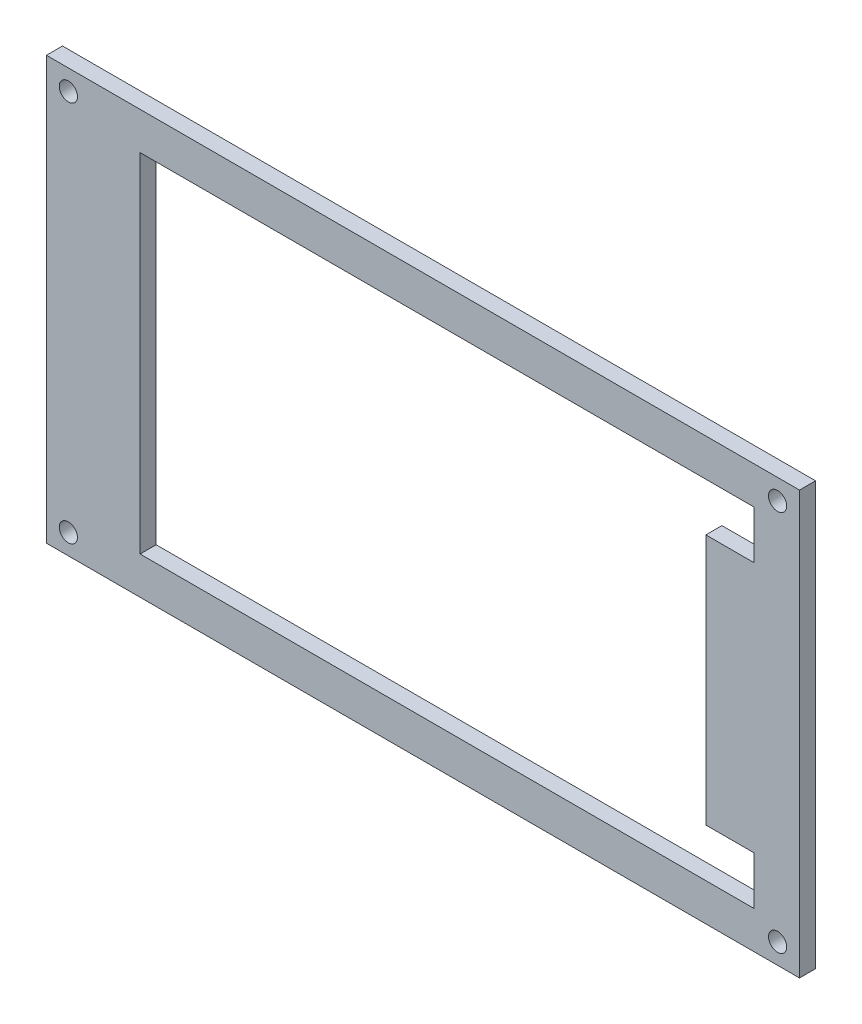
ISO-10303-21;
HEADER;
FILE_DESCRIPTION(('STEP AP214'),'2;1');
FILE_NAME('part.step','',(''),(''),'','','');
FILE_SCHEMA(('AUTOMOTIVE_DESIGN { 1 0 10303 214 1 1 1 1 }'));
ENDSEC;
DATA;
#1=APPLICATION_CONTEXT('core data for automotive mechanical design processes');
#2=APPLICATION_PROTOCOL_DEFINITION('international standard','automotive_design',2000,#1);
#3=PRODUCT_CONTEXT('',#1,'mechanical');
#4=PRODUCT('Part','Part','',(#3));
#5=PRODUCT_RELATED_PRODUCT_CATEGORY('part','',(#4));
#6=PRODUCT_DEFINITION_FORMATION('','',#4);
#7=PRODUCT_DEFINITION_CONTEXT('part definition',#1,'design');
#8=PRODUCT_DEFINITION('design','',#6,#7);
#9=PRODUCT_DEFINITION_SHAPE('','',#8);
#10=(LENGTH_UNIT() NAMED_UNIT(*) SI_UNIT(.MILLI.,.METRE.));
#11=(NAMED_UNIT(*) PLANE_ANGLE_UNIT() SI_UNIT($,.RADIAN.));
#12=(NAMED_UNIT(*) SI_UNIT($,.STERADIAN.) SOLID_ANGLE_UNIT());
#13=UNCERTAINTY_MEASURE_WITH_UNIT(LENGTH_MEASURE(1.E-05),#10,'distance_accuracy_value','');
#14=(GEOMETRIC_REPRESENTATION_CONTEXT(3) GLOBAL_UNCERTAINTY_ASSIGNED_CONTEXT((#13)) GLOBAL_UNIT_ASSIGNED_CONTEXT((#10,
#11,#12)) REPRESENTATION_CONTEXT('',''));
#15=CARTESIAN_POINT('',(0.,0.,0.));
#16=DIRECTION('',(0.,0.,1.));
#17=DIRECTION('',(1.,0.,0.));
#18=AXIS2_PLACEMENT_3D('',#15,#16,#17);
#19=CARTESIAN_POINT('',(0.,0.,3.));
#20=DIRECTION('',(0.,0.,1.));
#21=DIRECTION('',(1.,0.,0.));
#22=AXIS2_PLACEMENT_3D('',#19,#20,#21);
#23=PLANE('',#22);
#24=DIRECTION('',(-1.,0.,0.));
#25=VECTOR('',#24,1.);
#26=CARTESIAN_POINT('',(-52.85,32.475,3.));
#27=LINE('',#26,#25);
#28=CARTESIAN_POINT('',(61.85,32.475,3.));
#29=VERTEX_POINT('',#28);
#30=CARTESIAN_POINT('',(-52.85,32.475,3.));
#31=VERTEX_POINT('',#30);
#32=EDGE_CURVE('E182',#29,#31,#27,.T.);
#33=ORIENTED_EDGE('',*,*,#32,.F.);
#34=DIRECTION('',(0.,1.,0.));
#35=VECTOR('',#34,1.);
#36=CARTESIAN_POINT('',(61.85,32.475,3.));
#37=LINE('',#36,#35);
#38=CARTESIAN_POINT('',(61.85,23.475,3.));
#39=VERTEX_POINT('',#38);
#40=EDGE_CURVE('E153',#39,#29,#37,.T.);
#41=ORIENTED_EDGE('',*,*,#40,.F.);
#42=DIRECTION('',(1.,0.,0.));
#43=VECTOR('',#42,1.);
#44=CARTESIAN_POINT('',(52.85,23.475,3.));
#45=LINE('',#44,#43);
#46=CARTESIAN_POINT('',(52.85,23.475,3.));
#47=VERTEX_POINT('',#46);
#48=EDGE_CURVE('E132',#47,#39,#45,.T.);
#49=ORIENTED_EDGE('',*,*,#48,.F.);
#50=DIRECTION('',(0.,1.,0.));
#51=VECTOR('',#50,1.);
#52=CARTESIAN_POINT('',(52.85,32.475,3.));
#53=LINE('',#52,#51);
#54=CARTESIAN_POINT('',(52.85,-23.475,3.));
#55=VERTEX_POINT('',#54);
#56=EDGE_CURVE('E191',#55,#47,#53,.T.);
#57=ORIENTED_EDGE('',*,*,#56,.F.);
#58=DIRECTION('',(-1.,0.,0.));
#59=VECTOR('',#58,1.);
#60=CARTESIAN_POINT('',(52.85,-23.475,3.));
#61=LINE('',#60,#59);
#62=CARTESIAN_POINT('',(61.85,-23.475,3.));
#63=VERTEX_POINT('',#62);
#64=EDGE_CURVE('E170',#63,#55,#61,.T.);
#65=ORIENTED_EDGE('',*,*,#64,.F.);
#66=DIRECTION('',(0.,1.,0.));
#67=VECTOR('',#66,1.);
#68=CARTESIAN_POINT('',(61.85,-32.475,3.));
#69=LINE('',#68,#67);
#70=CARTESIAN_POINT('',(61.85,-32.475,3.));
#71=VERTEX_POINT('',#70);
#72=EDGE_CURVE('E157',#71,#63,#69,.T.);
#73=ORIENTED_EDGE('',*,*,#72,.F.);
#74=DIRECTION('',(1.,0.,0.));
#75=VECTOR('',#74,1.);
#76=CARTESIAN_POINT('',(-52.85,-32.475,3.));
#77=LINE('',#76,#75);
#78=CARTESIAN_POINT('',(-52.85,-32.475,3.));
#79=VERTEX_POINT('',#78);
#80=EDGE_CURVE('E189',#79,#71,#77,.T.);
#81=ORIENTED_EDGE('',*,*,#80,.F.);
#82=DIRECTION('',(0.,-1.,0.));
#83=VECTOR('',#82,1.);
#84=CARTESIAN_POINT('',(-52.85,32.475,3.));
#85=LINE('',#84,#83);
#86=EDGE_CURVE('E64',#31,#79,#85,.T.);
#87=ORIENTED_EDGE('',*,*,#86,.F.);
#88=EDGE_LOOP('',(#33,#41,#49,#57,#65,#73,#81,#87));
#89=FACE_BOUND('',#88,.T.);
#90=CARTESIAN_POINT('',(66.2527237899999,-35.6682686500001,3.));
#91=DIRECTION('',(0.,0.,1.));
#92=DIRECTION('',(1.,0.,0.));
#93=AXIS2_PLACEMENT_3D('',#90,#91,#92);
#94=CIRCLE('',#93,1.69999999999999);
#95=CARTESIAN_POINT('',(67.9527237899999,-35.6682686500001,3.));
#96=VERTEX_POINT('',#95);
#97=EDGE_CURVE('E206',#96,#96,#94,.T.);
#98=ORIENTED_EDGE('',*,*,#97,.F.);
#99=EDGE_LOOP('',(#98));
#100=FACE_BOUND('',#99,.T.);
#101=CARTESIAN_POINT('',(-66.25272379,35.66826865,3.));
#102=DIRECTION('',(0.,0.,1.));
#103=DIRECTION('',(1.,0.,0.));
#104=AXIS2_PLACEMENT_3D('',#101,#102,#103);
#105=CIRCLE('',#104,1.7);
#106=CARTESIAN_POINT('',(-64.55272379,35.66826865,3.));
#107=VERTEX_POINT('',#106);
#108=EDGE_CURVE('E218',#107,#107,#105,.T.);
#109=ORIENTED_EDGE('',*,*,#108,.F.);
#110=EDGE_LOOP('',(#109));
#111=FACE_BOUND('',#110,.T.);
#112=DIRECTION('',(0.,1.,0.));
#113=VECTOR('',#112,1.);
#114=CARTESIAN_POINT('',(70.35,39.475,3.));
#115=LINE('',#114,#113);
#116=CARTESIAN_POINT('',(70.35,-39.475,3.));
#117=VERTEX_POINT('',#116);
#118=CARTESIAN_POINT('',(70.35,39.475,3.));
#119=VERTEX_POINT('',#118);
#120=EDGE_CURVE('E224',#117,#119,#115,.T.);
#121=ORIENTED_EDGE('',*,*,#120,.T.);
#122=DIRECTION('',(-1.,0.,0.));
#123=VECTOR('',#122,1.);
#124=CARTESIAN_POINT('',(-70.35,39.475,3.));
#125=LINE('',#124,#123);
#126=CARTESIAN_POINT('',(-70.35,39.475,3.));
#127=VERTEX_POINT('',#126);
#128=EDGE_CURVE('E227',#119,#127,#125,.T.);
#129=ORIENTED_EDGE('',*,*,#128,.T.);
#130=DIRECTION('',(0.,-1.,0.));
#131=VECTOR('',#130,1.);
#132=CARTESIAN_POINT('',(-70.35,39.475,3.));
#133=LINE('',#132,#131);
#134=CARTESIAN_POINT('',(-70.35,-39.475,3.));
#135=VERTEX_POINT('',#134);
#136=EDGE_CURVE('E230',#127,#135,#133,.T.);
#137=ORIENTED_EDGE('',*,*,#136,.T.);
#138=DIRECTION('',(1.,0.,0.));
#139=VECTOR('',#138,1.);
#140=CARTESIAN_POINT('',(-70.35,-39.475,3.));
#141=LINE('',#140,#139);
#142=EDGE_CURVE('E232',#135,#117,#141,.T.);
#143=ORIENTED_EDGE('',*,*,#142,.T.);
#144=EDGE_LOOP('',(#121,#129,#137,#143));
#145=FACE_BOUND('',#144,.T.);
#146=CARTESIAN_POINT('',(66.2527237899999,35.6682686500001,3.));
#147=DIRECTION('',(0.,0.,1.));
#148=DIRECTION('',(-1.,0.,0.));
#149=AXIS2_PLACEMENT_3D('',#146,#147,#148);
#150=CIRCLE('',#149,1.69999999999999);
#151=CARTESIAN_POINT('',(64.5527237899999,35.6682686500001,3.));
#152=VERTEX_POINT('',#151);
#153=EDGE_CURVE('E212',#152,#152,#150,.T.);
#154=ORIENTED_EDGE('',*,*,#153,.F.);
#155=EDGE_LOOP('',(#154));
#156=FACE_BOUND('',#155,.T.);
#157=CARTESIAN_POINT('',(-66.25272379,-35.66826865,3.));
#158=DIRECTION('',(0.,0.,1.));
#159=DIRECTION('',(-1.,0.,0.));
#160=AXIS2_PLACEMENT_3D('',#157,#158,#159);
#161=CIRCLE('',#160,1.7);
#162=CARTESIAN_POINT('',(-67.95272379,-35.66826865,3.));
#163=VERTEX_POINT('',#162);
#164=EDGE_CURVE('E200',#163,#163,#161,.T.);
#165=ORIENTED_EDGE('',*,*,#164,.F.);
#166=EDGE_LOOP('',(#165));
#167=FACE_BOUND('',#166,.T.);
#168=ADVANCED_FACE('F41',(#89,#100,#111,#145,#156,#167),#23,.T.);
#169=CARTESIAN_POINT('',(0.,0.,0.));
#170=DIRECTION('',(0.,0.,1.));
#171=DIRECTION('',(1.,0.,0.));
#172=AXIS2_PLACEMENT_3D('',#169,#170,#171);
#173=PLANE('',#172);
#174=DIRECTION('',(0.,1.,0.));
#175=VECTOR('',#174,1.);
#176=CARTESIAN_POINT('',(61.85,32.475,0.));
#177=LINE('',#176,#175);
#178=CARTESIAN_POINT('',(61.85,23.475,0.));
#179=VERTEX_POINT('',#178);
#180=CARTESIAN_POINT('',(61.85,32.475,0.));
#181=VERTEX_POINT('',#180);
#182=EDGE_CURVE('E141',#179,#181,#177,.T.);
#183=ORIENTED_EDGE('',*,*,#182,.T.);
#184=DIRECTION('',(-1.,0.,0.));
#185=VECTOR('',#184,1.);
#186=CARTESIAN_POINT('',(-52.85,32.475,0.));
#187=LINE('',#186,#185);
#188=CARTESIAN_POINT('',(-52.85,32.475,0.));
#189=VERTEX_POINT('',#188);
#190=EDGE_CURVE('E185',#181,#189,#187,.T.);
#191=ORIENTED_EDGE('',*,*,#190,.T.);
#192=DIRECTION('',(0.,-1.,0.));
#193=VECTOR('',#192,1.);
#194=CARTESIAN_POINT('',(-52.85,32.475,0.));
#195=LINE('',#194,#193);
#196=CARTESIAN_POINT('',(-52.85,-32.475,0.));
#197=VERTEX_POINT('',#196);
#198=EDGE_CURVE('E178',#189,#197,#195,.T.);
#199=ORIENTED_EDGE('',*,*,#198,.T.);
#200=DIRECTION('',(1.,0.,0.));
#201=VECTOR('',#200,1.);
#202=CARTESIAN_POINT('',(-52.85,-32.475,0.));
#203=LINE('',#202,#201);
#204=CARTESIAN_POINT('',(61.85,-32.475,0.));
#205=VERTEX_POINT('',#204);
#206=EDGE_CURVE('E181',#197,#205,#203,.T.);
#207=ORIENTED_EDGE('',*,*,#206,.T.);
#208=DIRECTION('',(0.,1.,0.));
#209=VECTOR('',#208,1.);
#210=CARTESIAN_POINT('',(61.85,-32.475,0.));
#211=LINE('',#210,#209);
#212=CARTESIAN_POINT('',(61.85,-23.475,0.));
#213=VERTEX_POINT('',#212);
#214=EDGE_CURVE('E172',#205,#213,#211,.T.);
#215=ORIENTED_EDGE('',*,*,#214,.T.);
#216=DIRECTION('',(-1.,0.,0.));
#217=VECTOR('',#216,1.);
#218=CARTESIAN_POINT('',(52.85,-23.475,0.));
#219=LINE('',#218,#217);
#220=CARTESIAN_POINT('',(52.85,-23.475,0.));
#221=VERTEX_POINT('',#220);
#222=EDGE_CURVE('E164',#213,#221,#219,.T.);
#223=ORIENTED_EDGE('',*,*,#222,.T.);
#224=DIRECTION('',(0.,1.,0.));
#225=VECTOR('',#224,1.);
#226=CARTESIAN_POINT('',(52.85,32.475,0.));
#227=LINE('',#226,#225);
#228=CARTESIAN_POINT('',(52.85,23.475,0.));
#229=VERTEX_POINT('',#228);
#230=EDGE_CURVE('E152',#221,#229,#227,.T.);
#231=ORIENTED_EDGE('',*,*,#230,.T.);
#232=DIRECTION('',(1.,0.,0.));
#233=VECTOR('',#232,1.);
#234=CARTESIAN_POINT('',(52.85,23.475,0.));
#235=LINE('',#234,#233);
#236=EDGE_CURVE('E56',#229,#179,#235,.T.);
#237=ORIENTED_EDGE('',*,*,#236,.T.);
#238=EDGE_LOOP('',(#183,#191,#199,#207,#215,#223,#231,#237));
#239=FACE_BOUND('',#238,.T.);
#240=DIRECTION('',(0.,1.,0.));
#241=VECTOR('',#240,1.);
#242=CARTESIAN_POINT('',(70.35,39.475,0.));
#243=LINE('',#242,#241);
#244=CARTESIAN_POINT('',(70.35,-39.475,0.));
#245=VERTEX_POINT('',#244);
#246=CARTESIAN_POINT('',(70.35,39.475,0.));
#247=VERTEX_POINT('',#246);
#248=EDGE_CURVE('E221',#245,#247,#243,.T.);
#249=ORIENTED_EDGE('',*,*,#248,.F.);
#250=DIRECTION('',(1.,0.,0.));
#251=VECTOR('',#250,1.);
#252=CARTESIAN_POINT('',(-70.35,-39.475,0.));
#253=LINE('',#252,#251);
#254=CARTESIAN_POINT('',(-70.35,-39.475,0.));
#255=VERTEX_POINT('',#254);
#256=EDGE_CURVE('E228',#255,#245,#253,.T.);
#257=ORIENTED_EDGE('',*,*,#256,.F.);
#258=DIRECTION('',(0.,-1.,0.));
#259=VECTOR('',#258,1.);
#260=CARTESIAN_POINT('',(-70.35,39.475,0.));
#261=LINE('',#260,#259);
#262=CARTESIAN_POINT('',(-70.35,39.475,0.));
#263=VERTEX_POINT('',#262);
#264=EDGE_CURVE('E239',#263,#255,#261,.T.);
#265=ORIENTED_EDGE('',*,*,#264,.F.);
#266=DIRECTION('',(-1.,0.,0.));
#267=VECTOR('',#266,1.);
#268=CARTESIAN_POINT('',(-70.35,39.475,0.));
#269=LINE('',#268,#267);
#270=EDGE_CURVE('E237',#247,#263,#269,.T.);
#271=ORIENTED_EDGE('',*,*,#270,.F.);
#272=EDGE_LOOP('',(#249,#257,#265,#271));
#273=FACE_BOUND('',#272,.T.);
#274=CARTESIAN_POINT('',(-66.25272379,35.66826865,0.));
#275=DIRECTION('',(0.,0.,1.));
#276=DIRECTION('',(1.,0.,0.));
#277=AXIS2_PLACEMENT_3D('',#274,#275,#276);
#278=CIRCLE('',#277,1.7);
#279=CARTESIAN_POINT('',(-64.55272379,35.66826865,0.));
#280=VERTEX_POINT('',#279);
#281=EDGE_CURVE('E215',#280,#280,#278,.T.);
#282=ORIENTED_EDGE('',*,*,#281,.T.);
#283=EDGE_LOOP('',(#282));
#284=FACE_BOUND('',#283,.T.);
#285=CARTESIAN_POINT('',(66.2527237899999,35.6682686500001,0.));
#286=DIRECTION('',(0.,0.,1.));
#287=DIRECTION('',(-1.,0.,0.));
#288=AXIS2_PLACEMENT_3D('',#285,#286,#287);
#289=CIRCLE('',#288,1.69999999999999);
#290=CARTESIAN_POINT('',(64.5527237899999,35.6682686500001,0.));
#291=VERTEX_POINT('',#290);
#292=EDGE_CURVE('E209',#291,#291,#289,.T.);
#293=ORIENTED_EDGE('',*,*,#292,.T.);
#294=EDGE_LOOP('',(#293));
#295=FACE_BOUND('',#294,.T.);
#296=CARTESIAN_POINT('',(66.2527237899999,-35.6682686500001,0.));
#297=DIRECTION('',(0.,0.,1.));
#298=DIRECTION('',(1.,0.,0.));
#299=AXIS2_PLACEMENT_3D('',#296,#297,#298);
#300=CIRCLE('',#299,1.69999999999999);
#301=CARTESIAN_POINT('',(67.9527237899999,-35.6682686500001,0.));
#302=VERTEX_POINT('',#301);
#303=EDGE_CURVE('E203',#302,#302,#300,.T.);
#304=ORIENTED_EDGE('',*,*,#303,.T.);
#305=EDGE_LOOP('',(#304));
#306=FACE_BOUND('',#305,.T.);
#307=CARTESIAN_POINT('',(-66.25272379,-35.66826865,0.));
#308=DIRECTION('',(0.,0.,1.));
#309=DIRECTION('',(-1.,0.,0.));
#310=AXIS2_PLACEMENT_3D('',#307,#308,#309);
#311=CIRCLE('',#310,1.7);
#312=CARTESIAN_POINT('',(-67.95272379,-35.66826865,0.));
#313=VERTEX_POINT('',#312);
#314=EDGE_CURVE('E198',#313,#313,#311,.T.);
#315=ORIENTED_EDGE('',*,*,#314,.T.);
#316=EDGE_LOOP('',(#315));
#317=FACE_BOUND('',#316,.T.);
#318=ADVANCED_FACE('F148',(#239,#273,#284,#295,#306,#317),#173,.F.);
#319=CARTESIAN_POINT('',(70.35,39.475,3.));
#320=DIRECTION('',(-1.,0.,0.));
#321=DIRECTION('',(0.,-1.,0.));
#322=AXIS2_PLACEMENT_3D('',#319,#320,#321);
#323=PLANE('',#322);
#324=ORIENTED_EDGE('',*,*,#248,.T.);
#325=DIRECTION('',(0.,0.,-1.));
#326=VECTOR('',#325,1.);
#327=CARTESIAN_POINT('',(70.35,39.475,3.));
#328=LINE('',#327,#326);
#329=EDGE_CURVE('E11',#119,#247,#328,.T.);
#330=ORIENTED_EDGE('',*,*,#329,.F.);
#331=ORIENTED_EDGE('',*,*,#120,.F.);
#332=DIRECTION('',(0.,0.,-1.));
#333=VECTOR('',#332,1.);
#334=CARTESIAN_POINT('',(70.35,-39.475,3.));
#335=LINE('',#334,#333);
#336=EDGE_CURVE('E234',#117,#245,#335,.T.);
#337=ORIENTED_EDGE('',*,*,#336,.T.);
#338=EDGE_LOOP('',(#324,#330,#331,#337));
#339=FACE_BOUND('',#338,.T.);
#340=ADVANCED_FACE('F43',(#339),#323,.F.);
#341=CARTESIAN_POINT('',(-70.35,39.475,3.));
#342=DIRECTION('',(0.,-1.,0.));
#343=DIRECTION('',(0.,0.,-1.));
#344=AXIS2_PLACEMENT_3D('',#341,#342,#343);
#345=PLANE('',#344);
#346=ORIENTED_EDGE('',*,*,#270,.T.);
#347=DIRECTION('',(0.,0.,-1.));
#348=VECTOR('',#347,1.);
#349=CARTESIAN_POINT('',(-70.35,39.475,3.));
#350=LINE('',#349,#348);
#351=EDGE_CURVE('E49',#127,#263,#350,.T.);
#352=ORIENTED_EDGE('',*,*,#351,.F.);
#353=ORIENTED_EDGE('',*,*,#128,.F.);
#354=ORIENTED_EDGE('',*,*,#329,.T.);
#355=EDGE_LOOP('',(#346,#352,#353,#354));
#356=FACE_BOUND('',#355,.T.);
#357=ADVANCED_FACE('F266',(#356),#345,.F.);
#358=CARTESIAN_POINT('',(-70.35,39.475,3.));
#359=DIRECTION('',(1.,0.,0.));
#360=DIRECTION('',(0.,0.,-1.));
#361=AXIS2_PLACEMENT_3D('',#358,#359,#360);
#362=PLANE('',#361);
#363=ORIENTED_EDGE('',*,*,#264,.T.);
#364=DIRECTION('',(0.,0.,-1.));
#365=VECTOR('',#364,1.);
#366=CARTESIAN_POINT('',(-70.35,-39.475,3.));
#367=LINE('',#366,#365);
#368=EDGE_CURVE('E244',#135,#255,#367,.T.);
#369=ORIENTED_EDGE('',*,*,#368,.F.);
#370=ORIENTED_EDGE('',*,*,#136,.F.);
#371=ORIENTED_EDGE('',*,*,#351,.T.);
#372=EDGE_LOOP('',(#363,#369,#370,#371));
#373=FACE_BOUND('',#372,.T.);
#374=ADVANCED_FACE('F251',(#373),#362,.F.);
#375=CARTESIAN_POINT('',(-70.35,-39.475,3.));
#376=DIRECTION('',(0.,1.,0.));
#377=DIRECTION('',(0.,0.,1.));
#378=AXIS2_PLACEMENT_3D('',#375,#376,#377);
#379=PLANE('',#378);
#380=ORIENTED_EDGE('',*,*,#256,.T.);
#381=ORIENTED_EDGE('',*,*,#336,.F.);
#382=ORIENTED_EDGE('',*,*,#142,.F.);
#383=ORIENTED_EDGE('',*,*,#368,.T.);
#384=EDGE_LOOP('',(#380,#381,#382,#383));
#385=FACE_BOUND('',#384,.T.);
#386=ADVANCED_FACE('F259',(#385),#379,.F.);
#387=CARTESIAN_POINT('',(-66.25272379,35.66826865,3.));
#388=DIRECTION('',(0.,0.,-1.));
#389=DIRECTION('',(-1.,0.,0.));
#390=AXIS2_PLACEMENT_3D('',#387,#388,#389);
#391=CYLINDRICAL_SURFACE('',#390,1.7);
#392=ORIENTED_EDGE('',*,*,#108,.T.);
#393=EDGE_LOOP('',(#392));
#394=FACE_BOUND('',#393,.T.);
#395=ORIENTED_EDGE('',*,*,#281,.F.);
#396=EDGE_LOOP('',(#395));
#397=FACE_BOUND('',#396,.T.);
#398=ADVANCED_FACE('F283',(#394,#397),#391,.F.);
#399=CARTESIAN_POINT('',(66.2527237899999,35.6682686500001,3.));
#400=DIRECTION('',(0.,0.,-1.));
#401=DIRECTION('',(-1.,0.,0.));
#402=AXIS2_PLACEMENT_3D('',#399,#400,#401);
#403=CYLINDRICAL_SURFACE('',#402,1.69999999999999);
#404=ORIENTED_EDGE('',*,*,#153,.T.);
#405=EDGE_LOOP('',(#404));
#406=FACE_BOUND('',#405,.T.);
#407=ORIENTED_EDGE('',*,*,#292,.F.);
#408=EDGE_LOOP('',(#407));
#409=FACE_BOUND('',#408,.T.);
#410=ADVANCED_FACE('F290',(#406,#409),#403,.F.);
#411=CARTESIAN_POINT('',(66.2527237899999,-35.6682686500001,3.));
#412=DIRECTION('',(0.,0.,-1.));
#413=DIRECTION('',(-1.,0.,0.));
#414=AXIS2_PLACEMENT_3D('',#411,#412,#413);
#415=CYLINDRICAL_SURFACE('',#414,1.69999999999999);
#416=ORIENTED_EDGE('',*,*,#97,.T.);
#417=EDGE_LOOP('',(#416));
#418=FACE_BOUND('',#417,.T.);
#419=ORIENTED_EDGE('',*,*,#303,.F.);
#420=EDGE_LOOP('',(#419));
#421=FACE_BOUND('',#420,.T.);
#422=ADVANCED_FACE('F295',(#418,#421),#415,.F.);
#423=CARTESIAN_POINT('',(-66.25272379,-35.66826865,3.));
#424=DIRECTION('',(0.,0.,-1.));
#425=DIRECTION('',(-1.,0.,0.));
#426=AXIS2_PLACEMENT_3D('',#423,#424,#425);
#427=CYLINDRICAL_SURFACE('',#426,1.7);
#428=ORIENTED_EDGE('',*,*,#164,.T.);
#429=EDGE_LOOP('',(#428));
#430=FACE_BOUND('',#429,.T.);
#431=ORIENTED_EDGE('',*,*,#314,.F.);
#432=EDGE_LOOP('',(#431));
#433=FACE_BOUND('',#432,.T.);
#434=ADVANCED_FACE('F307',(#430,#433),#427,.F.);
#435=CARTESIAN_POINT('',(-52.85,32.475,0.));
#436=DIRECTION('',(-1.,0.,0.));
#437=DIRECTION('',(0.,-1.,0.));
#438=AXIS2_PLACEMENT_3D('',#435,#436,#437);
#439=PLANE('',#438);
#440=ORIENTED_EDGE('',*,*,#86,.T.);
#441=DIRECTION('',(0.,0.,1.));
#442=VECTOR('',#441,1.);
#443=CARTESIAN_POINT('',(-52.85,-32.475,0.));
#444=LINE('',#443,#442);
#445=EDGE_CURVE('E187',#197,#79,#444,.T.);
#446=ORIENTED_EDGE('',*,*,#445,.F.);
#447=ORIENTED_EDGE('',*,*,#198,.F.);
#448=DIRECTION('',(0.,0.,1.));
#449=VECTOR('',#448,1.);
#450=CARTESIAN_POINT('',(-52.85,32.475,0.));
#451=LINE('',#450,#449);
#452=EDGE_CURVE('E196',#189,#31,#451,.T.);
#453=ORIENTED_EDGE('',*,*,#452,.T.);
#454=EDGE_LOOP('',(#440,#446,#447,#453));
#455=FACE_BOUND('',#454,.T.);
#456=ADVANCED_FACE('F309',(#455),#439,.F.);
#457=CARTESIAN_POINT('',(-52.85,32.475,0.));
#458=DIRECTION('',(0.,1.,0.));
#459=DIRECTION('',(0.,0.,1.));
#460=AXIS2_PLACEMENT_3D('',#457,#458,#459);
#461=PLANE('',#460);
#462=ORIENTED_EDGE('',*,*,#32,.T.);
#463=ORIENTED_EDGE('',*,*,#452,.F.);
#464=ORIENTED_EDGE('',*,*,#190,.F.);
#465=DIRECTION('',(0.,0.,1.));
#466=VECTOR('',#465,1.);
#467=CARTESIAN_POINT('',(61.85,32.475,0.));
#468=LINE('',#467,#466);
#469=EDGE_CURVE('E136',#181,#29,#468,.T.);
#470=ORIENTED_EDGE('',*,*,#469,.T.);
#471=EDGE_LOOP('',(#462,#463,#464,#470));
#472=FACE_BOUND('',#471,.T.);
#473=ADVANCED_FACE('F315',(#472),#461,.F.);
#474=CARTESIAN_POINT('',(52.85,32.475,0.));
#475=DIRECTION('',(1.,0.,0.));
#476=DIRECTION('',(0.,1.,0.));
#477=AXIS2_PLACEMENT_3D('',#474,#475,#476);
#478=PLANE('',#477);
#479=ORIENTED_EDGE('',*,*,#56,.T.);
#480=DIRECTION('',(0.,0.,1.));
#481=VECTOR('',#480,1.);
#482=CARTESIAN_POINT('',(52.85,23.475,0.));
#483=LINE('',#482,#481);
#484=EDGE_CURVE('E137',#229,#47,#483,.T.);
#485=ORIENTED_EDGE('',*,*,#484,.F.);
#486=ORIENTED_EDGE('',*,*,#230,.F.);
#487=DIRECTION('',(0.,0.,1.));
#488=VECTOR('',#487,1.);
#489=CARTESIAN_POINT('',(52.85,-23.475,0.));
#490=LINE('',#489,#488);
#491=EDGE_CURVE('E167',#221,#55,#490,.T.);
#492=ORIENTED_EDGE('',*,*,#491,.T.);
#493=EDGE_LOOP('',(#479,#485,#486,#492));
#494=FACE_BOUND('',#493,.T.);
#495=ADVANCED_FACE('F324',(#494),#478,.F.);
#496=CARTESIAN_POINT('',(-52.85,-32.475,0.));
#497=DIRECTION('',(0.,-1.,0.));
#498=DIRECTION('',(0.,0.,-1.));
#499=AXIS2_PLACEMENT_3D('',#496,#497,#498);
#500=PLANE('',#499);
#501=ORIENTED_EDGE('',*,*,#80,.T.);
#502=DIRECTION('',(0.,0.,1.));
#503=VECTOR('',#502,1.);
#504=CARTESIAN_POINT('',(61.85,-32.475,0.));
#505=LINE('',#504,#503);
#506=EDGE_CURVE('E161',#205,#71,#505,.T.);
#507=ORIENTED_EDGE('',*,*,#506,.F.);
#508=ORIENTED_EDGE('',*,*,#206,.F.);
#509=ORIENTED_EDGE('',*,*,#445,.T.);
#510=EDGE_LOOP('',(#501,#507,#508,#509));
#511=FACE_BOUND('',#510,.T.);
#512=ADVANCED_FACE('F320',(#511),#500,.F.);
#513=CARTESIAN_POINT('',(52.85,-23.475,0.));
#514=DIRECTION('',(0.,1.,0.));
#515=DIRECTION('',(0.,0.,1.));
#516=AXIS2_PLACEMENT_3D('',#513,#514,#515);
#517=PLANE('',#516);
#518=ORIENTED_EDGE('',*,*,#64,.T.);
#519=ORIENTED_EDGE('',*,*,#491,.F.);
#520=ORIENTED_EDGE('',*,*,#222,.F.);
#521=DIRECTION('',(0.,0.,1.));
#522=VECTOR('',#521,1.);
#523=CARTESIAN_POINT('',(61.85,-23.475,0.));
#524=LINE('',#523,#522);
#525=EDGE_CURVE('E165',#213,#63,#524,.T.);
#526=ORIENTED_EDGE('',*,*,#525,.T.);
#527=EDGE_LOOP('',(#518,#519,#520,#526));
#528=FACE_BOUND('',#527,.T.);
#529=ADVANCED_FACE('F323',(#528),#517,.F.);
#530=CARTESIAN_POINT('',(61.85,-32.475,0.));
#531=DIRECTION('',(1.,0.,0.));
#532=DIRECTION('',(0.,1.,0.));
#533=AXIS2_PLACEMENT_3D('',#530,#531,#532);
#534=PLANE('',#533);
#535=ORIENTED_EDGE('',*,*,#72,.T.);
#536=ORIENTED_EDGE('',*,*,#525,.F.);
#537=ORIENTED_EDGE('',*,*,#214,.F.);
#538=ORIENTED_EDGE('',*,*,#506,.T.);
#539=EDGE_LOOP('',(#535,#536,#537,#538));
#540=FACE_BOUND('',#539,.T.);
#541=ADVANCED_FACE('F334',(#540),#534,.F.);
#542=CARTESIAN_POINT('',(61.85,32.475,0.));
#543=DIRECTION('',(1.,0.,0.));
#544=DIRECTION('',(0.,1.,0.));
#545=AXIS2_PLACEMENT_3D('',#542,#543,#544);
#546=PLANE('',#545);
#547=ORIENTED_EDGE('',*,*,#40,.T.);
#548=ORIENTED_EDGE('',*,*,#469,.F.);
#549=ORIENTED_EDGE('',*,*,#182,.F.);
#550=DIRECTION('',(0.,0.,1.));
#551=VECTOR('',#550,1.);
#552=CARTESIAN_POINT('',(61.85,23.475,0.));
#553=LINE('',#552,#551);
#554=EDGE_CURVE('E128',#179,#39,#553,.T.);
#555=ORIENTED_EDGE('',*,*,#554,.T.);
#556=EDGE_LOOP('',(#547,#548,#549,#555));
#557=FACE_BOUND('',#556,.T.);
#558=ADVANCED_FACE('F142',(#557),#546,.F.);
#559=CARTESIAN_POINT('',(52.85,23.475,0.));
#560=DIRECTION('',(0.,-1.,0.));
#561=DIRECTION('',(0.,0.,-1.));
#562=AXIS2_PLACEMENT_3D('',#559,#560,#561);
#563=PLANE('',#562);
#564=ORIENTED_EDGE('',*,*,#48,.T.);
#565=ORIENTED_EDGE('',*,*,#554,.F.);
#566=ORIENTED_EDGE('',*,*,#236,.F.);
#567=ORIENTED_EDGE('',*,*,#484,.T.);
#568=EDGE_LOOP('',(#564,#565,#566,#567));
#569=FACE_BOUND('',#568,.T.);
#570=ADVANCED_FACE('F130',(#569),#563,.F.);
#571=CLOSED_SHELL('',(#168,#318,#340,#357,#374,#386,#398,#410,#422,#434,#456,#473,#495,#512,
#529,#541,#558,#570));
#572=MANIFOLD_SOLID_BREP('B2',#571);
#573=ADVANCED_BREP_SHAPE_REPRESENTATION('',(#18,#572),#14);
#574=SHAPE_DEFINITION_REPRESENTATION(#9,#573);
ENDSEC;
END-ISO-10303-21;
